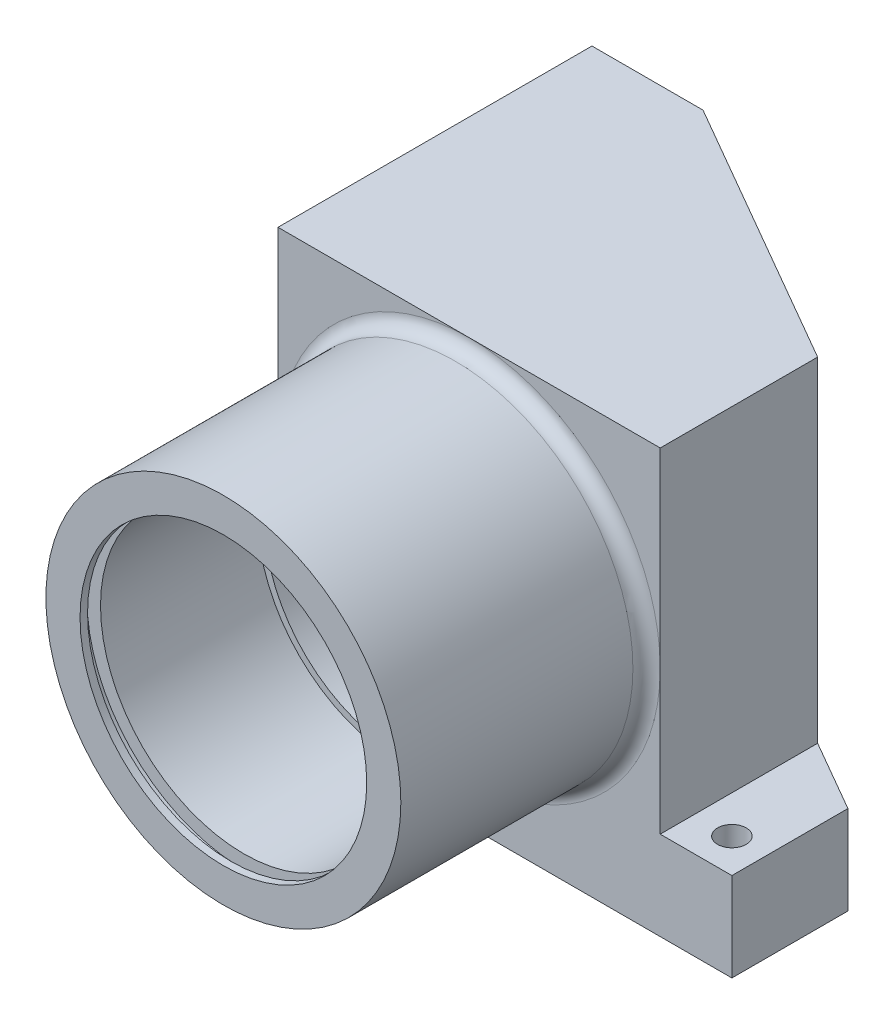
ISO-10303-21;
HEADER;
FILE_DESCRIPTION(('STEP AP214'),'2;1');
FILE_NAME('part.step','',(''),(''),'','','');
FILE_SCHEMA(('AUTOMOTIVE_DESIGN { 1 0 10303 214 1 1 1 1 }'));
ENDSEC;
DATA;
#1=APPLICATION_CONTEXT('core data for automotive mechanical design processes');
#2=APPLICATION_PROTOCOL_DEFINITION('international standard','automotive_design',2000,#1);
#3=PRODUCT_CONTEXT('',#1,'mechanical');
#4=PRODUCT('Part','Part','',(#3));
#5=PRODUCT_RELATED_PRODUCT_CATEGORY('part','',(#4));
#6=PRODUCT_DEFINITION_FORMATION('','',#4);
#7=PRODUCT_DEFINITION_CONTEXT('part definition',#1,'design');
#8=PRODUCT_DEFINITION('design','',#6,#7);
#9=PRODUCT_DEFINITION_SHAPE('','',#8);
#10=(LENGTH_UNIT() NAMED_UNIT(*) SI_UNIT(.MILLI.,.METRE.));
#11=(NAMED_UNIT(*) PLANE_ANGLE_UNIT() SI_UNIT($,.RADIAN.));
#12=(NAMED_UNIT(*) SI_UNIT($,.STERADIAN.) SOLID_ANGLE_UNIT());
#13=UNCERTAINTY_MEASURE_WITH_UNIT(LENGTH_MEASURE(1.E-05),#10,'distance_accuracy_value','');
#14=(GEOMETRIC_REPRESENTATION_CONTEXT(3) GLOBAL_UNCERTAINTY_ASSIGNED_CONTEXT((#13)) GLOBAL_UNIT_ASSIGNED_CONTEXT((#10,
#11,#12)) REPRESENTATION_CONTEXT('',''));
#15=CARTESIAN_POINT('',(0.,0.,0.));
#16=DIRECTION('',(0.,0.,1.));
#17=DIRECTION('',(1.,0.,0.));
#18=AXIS2_PLACEMENT_3D('',#15,#16,#17);
#19=CARTESIAN_POINT('',(28.,-34.,82.));
#20=DIRECTION('',(-1.,0.,0.));
#21=DIRECTION('',(0.,0.,1.));
#22=AXIS2_PLACEMENT_3D('',#19,#20,#21);
#23=PLANE('',#22);
#24=DIRECTION('',(0.,-1.,0.));
#25=VECTOR('',#24,1.);
#26=CARTESIAN_POINT('',(28.,-34.,22.937822173509));
#27=LINE('',#26,#25);
#28=CARTESIAN_POINT('',(28.,28.,22.937822173509));
#29=VERTEX_POINT('',#28);
#30=CARTESIAN_POINT('',(28.,-21.,22.937822173509));
#31=VERTEX_POINT('',#30);
#32=EDGE_CURVE('E52',#29,#31,#27,.T.);
#33=ORIENTED_EDGE('',*,*,#32,.F.);
#34=DIRECTION('',(0.,0.,-1.));
#35=VECTOR('',#34,1.);
#36=CARTESIAN_POINT('',(28.,28.,82.));
#37=LINE('',#36,#35);
#38=CARTESIAN_POINT('',(28.,28.,46.));
#39=VERTEX_POINT('',#38);
#40=EDGE_CURVE('E234',#39,#29,#37,.T.);
#41=ORIENTED_EDGE('',*,*,#40,.F.);
#42=DIRECTION('',(0.,1.,0.));
#43=VECTOR('',#42,1.);
#44=CARTESIAN_POINT('',(28.,-34.,46.));
#45=LINE('',#44,#43);
#46=CARTESIAN_POINT('',(28.,0.,46.));
#47=VERTEX_POINT('',#46);
#48=EDGE_CURVE('E191',#47,#39,#45,.T.);
#49=ORIENTED_EDGE('',*,*,#48,.F.);
#50=CARTESIAN_POINT('',(28.,-21.,46.));
#51=VERTEX_POINT('',#50);
#52=EDGE_CURVE('E193',#51,#47,#45,.T.);
#53=ORIENTED_EDGE('',*,*,#52,.F.);
#54=DIRECTION('',(0.,0.,1.));
#55=VECTOR('',#54,1.);
#56=CARTESIAN_POINT('',(28.,-21.,0.));
#57=LINE('',#56,#55);
#58=EDGE_CURVE('E176',#31,#51,#57,.T.);
#59=ORIENTED_EDGE('',*,*,#58,.F.);
#60=EDGE_LOOP('',(#33,#41,#49,#53,#59));
#61=FACE_BOUND('',#60,.T.);
#62=ADVANCED_FACE('F37',(#61),#23,.F.);
#63=CARTESIAN_POINT('',(-28.,28.,82.));
#64=DIRECTION('',(0.,-1.,0.));
#65=DIRECTION('',(0.,0.,-1.));
#66=AXIS2_PLACEMENT_3D('',#63,#64,#65);
#67=PLANE('',#66);
#68=DIRECTION('',(0.866025403784442,0.,0.499999999999995));
#69=VECTOR('',#68,1.);
#70=CARTESIAN_POINT('',(11.5746732002871,28.,13.4546553241673));
#71=LINE('',#70,#69);
#72=CARTESIAN_POINT('',(-11.7294734194981,28.,0.));
#73=VERTEX_POINT('',#72);
#74=EDGE_CURVE('E59',#73,#29,#71,.T.);
#75=ORIENTED_EDGE('',*,*,#74,.F.);
#76=DIRECTION('',(-1.,0.,0.));
#77=VECTOR('',#76,1.);
#78=CARTESIAN_POINT('',(-28.,28.,0.));
#79=LINE('',#78,#77);
#80=CARTESIAN_POINT('',(-28.,28.,0.));
#81=VERTEX_POINT('',#80);
#82=EDGE_CURVE('E224',#73,#81,#79,.T.);
#83=ORIENTED_EDGE('',*,*,#82,.T.);
#84=DIRECTION('',(0.,0.,-1.));
#85=VECTOR('',#84,1.);
#86=CARTESIAN_POINT('',(-28.,28.,82.));
#87=LINE('',#86,#85);
#88=CARTESIAN_POINT('',(-28.,28.,46.));
#89=VERTEX_POINT('',#88);
#90=EDGE_CURVE('E231',#89,#81,#87,.T.);
#91=ORIENTED_EDGE('',*,*,#90,.F.);
#92=DIRECTION('',(-1.,0.,0.));
#93=VECTOR('',#92,1.);
#94=CARTESIAN_POINT('',(28.,28.,46.));
#95=LINE('',#94,#93);
#96=CARTESIAN_POINT('',(0.,28.,46.));
#97=VERTEX_POINT('',#96);
#98=EDGE_CURVE('E195',#97,#89,#95,.T.);
#99=ORIENTED_EDGE('',*,*,#98,.F.);
#100=EDGE_CURVE('E196',#39,#97,#95,.T.);
#101=ORIENTED_EDGE('',*,*,#100,.F.);
#102=ORIENTED_EDGE('',*,*,#40,.T.);
#103=EDGE_LOOP('',(#75,#83,#91,#99,#101,#102));
#104=FACE_BOUND('',#103,.T.);
#105=ADVANCED_FACE('F265',(#104),#67,.F.);
#106=CARTESIAN_POINT('',(-28.,-34.,82.));
#107=DIRECTION('',(0.,1.,0.));
#108=DIRECTION('',(0.,0.,1.));
#109=AXIS2_PLACEMENT_3D('',#106,#107,#108);
#110=PLANE('',#109);
#111=CARTESIAN_POINT('',(-33.5,-34.,5.));
#112=DIRECTION('',(0.,-1.,0.));
#113=DIRECTION('',(0.,0.,-1.));
#114=AXIS2_PLACEMENT_3D('',#111,#112,#113);
#115=CIRCLE('',#114,2.1);
#116=CARTESIAN_POINT('',(-33.5,-34.,2.9));
#117=VERTEX_POINT('',#116);
#118=EDGE_CURVE('E336',#117,#117,#115,.T.);
#119=ORIENTED_EDGE('',*,*,#118,.F.);
#120=EDGE_LOOP('',(#119));
#121=FACE_BOUND('',#120,.T.);
#122=CARTESIAN_POINT('',(33.5,-34.,41.));
#123=DIRECTION('',(0.,-1.,0.));
#124=DIRECTION('',(0.,0.,-1.));
#125=AXIS2_PLACEMENT_3D('',#122,#123,#124);
#126=CIRCLE('',#125,2.1);
#127=CARTESIAN_POINT('',(33.5,-34.,38.9));
#128=VERTEX_POINT('',#127);
#129=EDGE_CURVE('E330',#128,#128,#126,.T.);
#130=ORIENTED_EDGE('',*,*,#129,.F.);
#131=EDGE_LOOP('',(#130));
#132=FACE_BOUND('',#131,.T.);
#133=CARTESIAN_POINT('',(-33.5,-34.,41.));
#134=DIRECTION('',(0.,-1.,0.));
#135=DIRECTION('',(0.,0.,-1.));
#136=AXIS2_PLACEMENT_3D('',#133,#134,#135);
#137=CIRCLE('',#136,2.1);
#138=CARTESIAN_POINT('',(-33.5,-34.,38.9));
#139=VERTEX_POINT('',#138);
#140=EDGE_CURVE('E324',#139,#139,#137,.T.);
#141=ORIENTED_EDGE('',*,*,#140,.F.);
#142=EDGE_LOOP('',(#141));
#143=FACE_BOUND('',#142,.T.);
#144=DIRECTION('',(-0.866025403784442,0.,-0.499999999999995));
#145=VECTOR('',#144,1.);
#146=CARTESIAN_POINT('',(38.5,-34.,29.));
#147=LINE('',#146,#145);
#148=CARTESIAN_POINT('',(38.5,-34.,29.));
#149=VERTEX_POINT('',#148);
#150=CARTESIAN_POINT('',(-11.7294734194981,-34.,0.));
#151=VERTEX_POINT('',#150);
#152=EDGE_CURVE('E140',#149,#151,#147,.T.);
#153=ORIENTED_EDGE('',*,*,#152,.F.);
#154=DIRECTION('',(0.,0.,1.));
#155=VECTOR('',#154,1.);
#156=CARTESIAN_POINT('',(38.5,-34.,0.));
#157=LINE('',#156,#155);
#158=CARTESIAN_POINT('',(38.5,-34.,46.));
#159=VERTEX_POINT('',#158);
#160=EDGE_CURVE('E132',#149,#159,#157,.T.);
#161=ORIENTED_EDGE('',*,*,#160,.T.);
#162=DIRECTION('',(1.,0.,0.));
#163=VECTOR('',#162,1.);
#164=CARTESIAN_POINT('',(-28.,-34.,46.));
#165=LINE('',#164,#163);
#166=CARTESIAN_POINT('',(-38.5,-34.,46.));
#167=VERTEX_POINT('',#166);
#168=EDGE_CURVE('E203',#167,#159,#165,.T.);
#169=ORIENTED_EDGE('',*,*,#168,.F.);
#170=DIRECTION('',(0.,0.,1.));
#171=VECTOR('',#170,1.);
#172=CARTESIAN_POINT('',(-38.5,-34.,0.));
#173=LINE('',#172,#171);
#174=CARTESIAN_POINT('',(-38.5,-34.,0.));
#175=VERTEX_POINT('',#174);
#176=EDGE_CURVE('E155',#175,#167,#173,.T.);
#177=ORIENTED_EDGE('',*,*,#176,.F.);
#178=DIRECTION('',(1.,0.,0.));
#179=VECTOR('',#178,1.);
#180=CARTESIAN_POINT('',(-28.,-34.,0.));
#181=LINE('',#180,#179);
#182=EDGE_CURVE('E228',#175,#151,#181,.T.);
#183=ORIENTED_EDGE('',*,*,#182,.T.);
#184=EDGE_LOOP('',(#153,#161,#169,#177,#183));
#185=FACE_BOUND('',#184,.T.);
#186=ADVANCED_FACE('F302',(#121,#132,#143,#185),#110,.F.);
#187=CARTESIAN_POINT('',(28.,28.,0.));
#188=DIRECTION('',(0.,0.,-1.));
#189=DIRECTION('',(-1.,0.,0.));
#190=AXIS2_PLACEMENT_3D('',#187,#188,#189);
#191=PLANE('',#190);
#192=ORIENTED_EDGE('',*,*,#82,.F.);
#193=DIRECTION('',(0.,1.,0.));
#194=VECTOR('',#193,1.);
#195=CARTESIAN_POINT('',(-11.7294734194981,-34.,0.));
#196=LINE('',#195,#194);
#197=CARTESIAN_POINT('',(-11.7294734194981,19.7843234228843,0.));
#198=VERTEX_POINT('',#197);
#199=EDGE_CURVE('E150',#198,#73,#196,.T.);
#200=ORIENTED_EDGE('',*,*,#199,.F.);
#201=CARTESIAN_POINT('',(0.,0.,0.));
#202=DIRECTION('',(0.,0.,-1.));
#203=DIRECTION('',(-1.,0.,0.));
#204=AXIS2_PLACEMENT_3D('',#201,#202,#203);
#205=CIRCLE('',#204,23.);
#206=CARTESIAN_POINT('',(-11.7294734194981,-19.7843234228843,0.));
#207=VERTEX_POINT('',#206);
#208=EDGE_CURVE('E215',#207,#198,#205,.T.);
#209=ORIENTED_EDGE('',*,*,#208,.F.);
#210=EDGE_CURVE('E146',#151,#207,#196,.T.);
#211=ORIENTED_EDGE('',*,*,#210,.F.);
#212=ORIENTED_EDGE('',*,*,#182,.F.);
#213=DIRECTION('',(0.,-1.,0.));
#214=VECTOR('',#213,1.);
#215=CARTESIAN_POINT('',(-38.5,-21.,0.));
#216=LINE('',#215,#214);
#217=CARTESIAN_POINT('',(-38.5,-21.,0.));
#218=VERTEX_POINT('',#217);
#219=EDGE_CURVE('E170',#218,#175,#216,.T.);
#220=ORIENTED_EDGE('',*,*,#219,.F.);
#221=DIRECTION('',(1.,0.,0.));
#222=VECTOR('',#221,1.);
#223=CARTESIAN_POINT('',(0.,-21.,0.));
#224=LINE('',#223,#222);
#225=CARTESIAN_POINT('',(-28.,-21.,0.));
#226=VERTEX_POINT('',#225);
#227=EDGE_CURVE('E161',#218,#226,#224,.T.);
#228=ORIENTED_EDGE('',*,*,#227,.T.);
#229=DIRECTION('',(0.,-1.,0.));
#230=VECTOR('',#229,1.);
#231=CARTESIAN_POINT('',(-28.,-34.,0.));
#232=LINE('',#231,#230);
#233=EDGE_CURVE('E226',#81,#226,#232,.T.);
#234=ORIENTED_EDGE('',*,*,#233,.F.);
#235=EDGE_LOOP('',(#192,#200,#209,#211,#212,#220,#228,#234));
#236=FACE_BOUND('',#235,.T.);
#237=ADVANCED_FACE('F308',(#236),#191,.T.);
#238=CARTESIAN_POINT('',(0.,0.,-5.71926183618582));
#239=DIRECTION('',(0.,0.,-1.));
#240=DIRECTION('',(-1.,0.,0.));
#241=AXIS2_PLACEMENT_3D('',#238,#239,#240);
#242=CYLINDRICAL_SURFACE('',#241,23.);
#243=CARTESIAN_POINT('',(0.,0.,52.));
#244=DIRECTION('',(0.,0.,-1.));
#245=DIRECTION('',(-1.,0.,0.));
#246=AXIS2_PLACEMENT_3D('',#243,#244,#245);
#247=CIRCLE('',#246,23.);
#248=CARTESIAN_POINT('',(-23.,0.,52.));
#249=VERTEX_POINT('',#248);
#250=EDGE_CURVE('E212',#249,#249,#247,.T.);
#251=ORIENTED_EDGE('',*,*,#250,.F.);
#252=EDGE_LOOP('',(#251));
#253=FACE_BOUND('',#252,.T.);
#254=CARTESIAN_POINT('',(0.,0.,6.77201463619972));
#255=DIRECTION('',(0.499999999999995,0.,-0.866025403784442));
#256=DIRECTION('',(-0.866025403784442,0.,-0.499999999999995));
#257=AXIS2_PLACEMENT_3D('',#254,#255,#256);
#258=ELLIPSE('',#257,26.5581123827227,23.);
#259=EDGE_CURVE('E148',#207,#198,#258,.F.);
#260=ORIENTED_EDGE('',*,*,#259,.F.);
#261=ORIENTED_EDGE('',*,*,#208,.T.);
#262=EDGE_LOOP('',(#260,#261));
#263=FACE_BOUND('',#262,.T.);
#264=ADVANCED_FACE('F311',(#253,#263),#242,.F.);
#265=CARTESIAN_POINT('',(38.5,-21.,0.));
#266=DIRECTION('',(1.,0.,0.));
#267=DIRECTION('',(0.,0.,-1.));
#268=AXIS2_PLACEMENT_3D('',#265,#266,#267);
#269=PLANE('',#268);
#270=ORIENTED_EDGE('',*,*,#160,.F.);
#271=DIRECTION('',(0.,1.,0.));
#272=VECTOR('',#271,1.);
#273=CARTESIAN_POINT('',(38.5,-34.,29.));
#274=LINE('',#273,#272);
#275=CARTESIAN_POINT('',(38.5,-21.,29.));
#276=VERTEX_POINT('',#275);
#277=EDGE_CURVE('E136',#149,#276,#274,.T.);
#278=ORIENTED_EDGE('',*,*,#277,.T.);
#279=DIRECTION('',(0.,0.,1.));
#280=VECTOR('',#279,1.);
#281=CARTESIAN_POINT('',(38.5,-21.,0.));
#282=LINE('',#281,#280);
#283=CARTESIAN_POINT('',(38.5,-21.,46.));
#284=VERTEX_POINT('',#283);
#285=EDGE_CURVE('E124',#276,#284,#282,.T.);
#286=ORIENTED_EDGE('',*,*,#285,.T.);
#287=DIRECTION('',(0.,-1.,0.));
#288=VECTOR('',#287,1.);
#289=CARTESIAN_POINT('',(38.5,-21.,46.));
#290=LINE('',#289,#288);
#291=EDGE_CURVE('E178',#284,#159,#290,.T.);
#292=ORIENTED_EDGE('',*,*,#291,.T.);
#293=EDGE_LOOP('',(#270,#278,#286,#292));
#294=FACE_BOUND('',#293,.T.);
#295=ADVANCED_FACE('F137',(#294),#269,.T.);
#296=CARTESIAN_POINT('',(0.,-21.,0.));
#297=DIRECTION('',(0.,-1.,0.));
#298=DIRECTION('',(0.,0.,-1.));
#299=AXIS2_PLACEMENT_3D('',#296,#297,#298);
#300=PLANE('',#299);
#301=CARTESIAN_POINT('',(33.5,-21.,41.));
#302=DIRECTION('',(0.,-1.,0.));
#303=DIRECTION('',(0.,0.,-1.));
#304=AXIS2_PLACEMENT_3D('',#301,#302,#303);
#305=CIRCLE('',#304,2.1);
#306=CARTESIAN_POINT('',(33.5,-21.,38.9));
#307=VERTEX_POINT('',#306);
#308=EDGE_CURVE('E327',#307,#307,#305,.T.);
#309=ORIENTED_EDGE('',*,*,#308,.T.);
#310=EDGE_LOOP('',(#309));
#311=FACE_BOUND('',#310,.T.);
#312=DIRECTION('',(0.866025403784442,0.,0.499999999999995));
#313=VECTOR('',#312,1.);
#314=CARTESIAN_POINT('',(-2.93236835487448,-21.,5.07901097714982));
#315=LINE('',#314,#313);
#316=EDGE_CURVE('E11',#31,#276,#315,.T.);
#317=ORIENTED_EDGE('',*,*,#316,.F.);
#318=ORIENTED_EDGE('',*,*,#58,.T.);
#319=DIRECTION('',(1.,0.,0.));
#320=VECTOR('',#319,1.);
#321=CARTESIAN_POINT('',(0.,-21.,46.));
#322=LINE('',#321,#320);
#323=EDGE_CURVE('E128',#51,#284,#322,.T.);
#324=ORIENTED_EDGE('',*,*,#323,.T.);
#325=ORIENTED_EDGE('',*,*,#285,.F.);
#326=EDGE_LOOP('',(#317,#318,#324,#325));
#327=FACE_BOUND('',#326,.T.);
#328=ADVANCED_FACE('F126',(#311,#327),#300,.F.);
#329=CARTESIAN_POINT('',(-28.,-34.,82.));
#330=DIRECTION('',(1.,0.,0.));
#331=DIRECTION('',(0.,0.,-1.));
#332=AXIS2_PLACEMENT_3D('',#329,#330,#331);
#333=PLANE('',#332);
#334=DIRECTION('',(0.,0.,-1.));
#335=VECTOR('',#334,1.);
#336=CARTESIAN_POINT('',(-28.,-21.,0.));
#337=LINE('',#336,#335);
#338=CARTESIAN_POINT('',(-28.,-21.,46.));
#339=VERTEX_POINT('',#338);
#340=EDGE_CURVE('E164',#339,#226,#337,.T.);
#341=ORIENTED_EDGE('',*,*,#340,.F.);
#342=DIRECTION('',(0.,-1.,0.));
#343=VECTOR('',#342,1.);
#344=CARTESIAN_POINT('',(-28.,28.,46.));
#345=LINE('',#344,#343);
#346=CARTESIAN_POINT('',(-28.,0.,46.));
#347=VERTEX_POINT('',#346);
#348=EDGE_CURVE('E199',#347,#339,#345,.T.);
#349=ORIENTED_EDGE('',*,*,#348,.F.);
#350=EDGE_CURVE('E200',#89,#347,#345,.T.);
#351=ORIENTED_EDGE('',*,*,#350,.F.);
#352=ORIENTED_EDGE('',*,*,#90,.T.);
#353=ORIENTED_EDGE('',*,*,#233,.T.);
#354=EDGE_LOOP('',(#341,#349,#351,#352,#353));
#355=FACE_BOUND('',#354,.T.);
#356=ADVANCED_FACE('F259',(#355),#333,.F.);
#357=CARTESIAN_POINT('',(28.,28.,46.));
#358=DIRECTION('',(0.,0.,1.));
#359=DIRECTION('',(1.,0.,0.));
#360=AXIS2_PLACEMENT_3D('',#357,#358,#359);
#361=PLANE('',#360);
#362=ORIENTED_EDGE('',*,*,#168,.T.);
#363=ORIENTED_EDGE('',*,*,#291,.F.);
#364=ORIENTED_EDGE('',*,*,#323,.F.);
#365=ORIENTED_EDGE('',*,*,#52,.T.);
#366=CARTESIAN_POINT('',(0.,0.,46.));
#367=DIRECTION('',(0.,0.,1.));
#368=DIRECTION('',(1.,0.,0.));
#369=AXIS2_PLACEMENT_3D('',#366,#367,#368);
#370=CIRCLE('',#369,28.);
#371=EDGE_CURVE('E45',#47,#347,#370,.F.);
#372=ORIENTED_EDGE('',*,*,#371,.T.);
#373=ORIENTED_EDGE('',*,*,#348,.T.);
#374=DIRECTION('',(1.,0.,0.));
#375=VECTOR('',#374,1.);
#376=CARTESIAN_POINT('',(0.,-21.,46.));
#377=LINE('',#376,#375);
#378=CARTESIAN_POINT('',(-38.5,-21.,46.));
#379=VERTEX_POINT('',#378);
#380=EDGE_CURVE('E156',#379,#339,#377,.T.);
#381=ORIENTED_EDGE('',*,*,#380,.F.);
#382=DIRECTION('',(0.,-1.,0.));
#383=VECTOR('',#382,1.);
#384=CARTESIAN_POINT('',(-38.5,-21.,46.));
#385=LINE('',#384,#383);
#386=EDGE_CURVE('E167',#379,#167,#385,.T.);
#387=ORIENTED_EDGE('',*,*,#386,.T.);
#388=EDGE_LOOP('',(#362,#363,#364,#365,#372,#373,#381,#387));
#389=FACE_BOUND('',#388,.T.);
#390=ADVANCED_FACE('F252',(#389),#361,.T.);
#391=ORIENTED_EDGE('',*,*,#350,.T.);
#392=CARTESIAN_POINT('',(0.,0.,46.));
#393=DIRECTION('',(0.,0.,1.));
#394=DIRECTION('',(1.,0.,0.));
#395=AXIS2_PLACEMENT_3D('',#392,#393,#394);
#396=CIRCLE('',#395,28.);
#397=EDGE_CURVE('E246',#347,#97,#396,.F.);
#398=ORIENTED_EDGE('',*,*,#397,.T.);
#399=ORIENTED_EDGE('',*,*,#98,.T.);
#400=EDGE_LOOP('',(#391,#398,#399));
#401=FACE_BOUND('',#400,.T.);
#402=ADVANCED_FACE('F262',(#401),#361,.T.);
#403=CARTESIAN_POINT('',(0.,0.,-5.71926183618582));
#404=DIRECTION('',(0.,0.,-1.));
#405=DIRECTION('',(-1.,0.,0.));
#406=AXIS2_PLACEMENT_3D('',#403,#404,#405);
#407=CYLINDRICAL_SURFACE('',#406,21.);
#408=CARTESIAN_POINT('',(0.,0.,79.));
#409=DIRECTION('',(0.,0.,-1.));
#410=DIRECTION('',(-1.,0.,0.));
#411=AXIS2_PLACEMENT_3D('',#408,#409,#410);
#412=CIRCLE('',#411,21.);
#413=CARTESIAN_POINT('',(-21.,0.,79.));
#414=VERTEX_POINT('',#413);
#415=EDGE_CURVE('E192',#414,#414,#412,.F.);
#416=ORIENTED_EDGE('',*,*,#415,.T.);
#417=EDGE_LOOP('',(#416));
#418=FACE_BOUND('',#417,.T.);
#419=CARTESIAN_POINT('',(0.,0.,56.));
#420=DIRECTION('',(0.,0.,-1.));
#421=DIRECTION('',(-1.,0.,0.));
#422=AXIS2_PLACEMENT_3D('',#419,#420,#421);
#423=CIRCLE('',#422,21.);
#424=CARTESIAN_POINT('',(-21.,0.,56.));
#425=VERTEX_POINT('',#424);
#426=EDGE_CURVE('E221',#425,#425,#423,.T.);
#427=ORIENTED_EDGE('',*,*,#426,.T.);
#428=EDGE_LOOP('',(#427));
#429=FACE_BOUND('',#428,.T.);
#430=ADVANCED_FACE('F285',(#418,#429),#407,.F.);
#431=CARTESIAN_POINT('',(28.,28.,82.));
#432=DIRECTION('',(0.,0.,-1.));
#433=DIRECTION('',(-1.,0.,0.));
#434=AXIS2_PLACEMENT_3D('',#431,#432,#433);
#435=PLANE('',#434);
#436=CARTESIAN_POINT('',(0.,0.,82.));
#437=DIRECTION('',(0.,0.,-1.));
#438=DIRECTION('',(-1.,0.,0.));
#439=AXIS2_PLACEMENT_3D('',#436,#437,#438);
#440=CIRCLE('',#439,21.);
#441=CARTESIAN_POINT('',(-21.,0.,82.));
#442=VERTEX_POINT('',#441);
#443=EDGE_CURVE('E218',#442,#442,#440,.T.);
#444=ORIENTED_EDGE('',*,*,#443,.T.);
#445=EDGE_LOOP('',(#444));
#446=FACE_BOUND('',#445,.T.);
#447=CARTESIAN_POINT('',(0.,0.,82.));
#448=DIRECTION('',(0.,0.,1.));
#449=DIRECTION('',(1.,0.,0.));
#450=AXIS2_PLACEMENT_3D('',#447,#448,#449);
#451=CIRCLE('',#450,26.);
#452=CARTESIAN_POINT('',(26.,0.,82.));
#453=VERTEX_POINT('',#452);
#454=EDGE_CURVE('E188',#453,#453,#451,.T.);
#455=ORIENTED_EDGE('',*,*,#454,.T.);
#456=EDGE_LOOP('',(#455));
#457=FACE_BOUND('',#456,.T.);
#458=ADVANCED_FACE('F282',(#446,#457),#435,.F.);
#459=CARTESIAN_POINT('',(0.,21.,56.));
#460=DIRECTION('',(0.,0.,-1.));
#461=DIRECTION('',(-1.,0.,0.));
#462=AXIS2_PLACEMENT_3D('',#459,#460,#461);
#463=PLANE('',#462);
#464=ORIENTED_EDGE('',*,*,#426,.F.);
#465=EDGE_LOOP('',(#464));
#466=FACE_BOUND('',#465,.T.);
#467=CARTESIAN_POINT('',(0.,0.,56.));
#468=DIRECTION('',(0.,0.,-1.));
#469=DIRECTION('',(-1.,0.,0.));
#470=AXIS2_PLACEMENT_3D('',#467,#468,#469);
#471=CIRCLE('',#470,20.);
#472=CARTESIAN_POINT('',(-20.,0.,56.));
#473=VERTEX_POINT('',#472);
#474=EDGE_CURVE('E206',#473,#473,#471,.T.);
#475=ORIENTED_EDGE('',*,*,#474,.T.);
#476=EDGE_LOOP('',(#475));
#477=FACE_BOUND('',#476,.T.);
#478=ADVANCED_FACE('F284',(#466,#477),#463,.F.);
#479=CARTESIAN_POINT('',(0.,0.,80.9));
#480=DIRECTION('',(0.,0.,1.));
#481=DIRECTION('',(1.,0.,0.));
#482=AXIS2_PLACEMENT_3D('',#479,#480,#481);
#483=CIRCLE('',#482,21.);
#484=CARTESIAN_POINT('',(21.,0.,80.9));
#485=VERTEX_POINT('',#484);
#486=EDGE_CURVE('E187',#485,#485,#483,.F.);
#487=ORIENTED_EDGE('',*,*,#486,.T.);
#488=EDGE_LOOP('',(#487));
#489=FACE_BOUND('',#488,.T.);
#490=ORIENTED_EDGE('',*,*,#443,.F.);
#491=EDGE_LOOP('',(#490));
#492=FACE_BOUND('',#491,.T.);
#493=ADVANCED_FACE('F292',(#489,#492),#407,.F.);
#494=CARTESIAN_POINT('',(0.,23.,52.));
#495=DIRECTION('',(0.,0.,1.));
#496=DIRECTION('',(1.,0.,0.));
#497=AXIS2_PLACEMENT_3D('',#494,#495,#496);
#498=PLANE('',#497);
#499=CARTESIAN_POINT('',(0.,0.,52.));
#500=DIRECTION('',(0.,0.,-1.));
#501=DIRECTION('',(-1.,0.,0.));
#502=AXIS2_PLACEMENT_3D('',#499,#500,#501);
#503=CIRCLE('',#502,20.);
#504=CARTESIAN_POINT('',(-20.,0.,52.));
#505=VERTEX_POINT('',#504);
#506=EDGE_CURVE('E209',#505,#505,#503,.T.);
#507=ORIENTED_EDGE('',*,*,#506,.F.);
#508=EDGE_LOOP('',(#507));
#509=FACE_BOUND('',#508,.T.);
#510=ORIENTED_EDGE('',*,*,#250,.T.);
#511=EDGE_LOOP('',(#510));
#512=FACE_BOUND('',#511,.T.);
#513=ADVANCED_FACE('F387',(#509,#512),#498,.F.);
#514=CARTESIAN_POINT('',(0.,0.,-5.71926183618582));
#515=DIRECTION('',(0.,0.,-1.));
#516=DIRECTION('',(-1.,0.,0.));
#517=AXIS2_PLACEMENT_3D('',#514,#515,#516);
#518=CYLINDRICAL_SURFACE('',#517,20.);
#519=ORIENTED_EDGE('',*,*,#474,.F.);
#520=EDGE_LOOP('',(#519));
#521=FACE_BOUND('',#520,.T.);
#522=ORIENTED_EDGE('',*,*,#506,.T.);
#523=EDGE_LOOP('',(#522));
#524=FACE_BOUND('',#523,.T.);
#525=ADVANCED_FACE('F384',(#521,#524),#518,.F.);
#526=ORIENTED_EDGE('',*,*,#100,.T.);
#527=CARTESIAN_POINT('',(0.,0.,46.));
#528=DIRECTION('',(0.,0.,1.));
#529=DIRECTION('',(1.,0.,0.));
#530=AXIS2_PLACEMENT_3D('',#527,#528,#529);
#531=CIRCLE('',#530,28.);
#532=EDGE_CURVE('E243',#97,#47,#531,.F.);
#533=ORIENTED_EDGE('',*,*,#532,.T.);
#534=ORIENTED_EDGE('',*,*,#48,.T.);
#535=EDGE_LOOP('',(#526,#533,#534));
#536=FACE_BOUND('',#535,.T.);
#537=ADVANCED_FACE('F267',(#536),#361,.T.);
#538=CARTESIAN_POINT('',(0.,0.,46.));
#539=DIRECTION('',(0.,0.,1.));
#540=DIRECTION('',(1.,0.,0.));
#541=AXIS2_PLACEMENT_3D('',#538,#539,#540);
#542=CYLINDRICAL_SURFACE('',#541,26.);
#543=CARTESIAN_POINT('',(0.,0.,48.));
#544=DIRECTION('',(0.,0.,1.));
#545=DIRECTION('',(1.,0.,0.));
#546=AXIS2_PLACEMENT_3D('',#543,#544,#545);
#547=CIRCLE('',#546,26.);
#548=CARTESIAN_POINT('',(26.,0.,48.));
#549=VERTEX_POINT('',#548);
#550=EDGE_CURVE('E236',#549,#549,#547,.T.);
#551=ORIENTED_EDGE('',*,*,#550,.T.);
#552=EDGE_LOOP('',(#551));
#553=FACE_BOUND('',#552,.T.);
#554=ORIENTED_EDGE('',*,*,#454,.F.);
#555=EDGE_LOOP('',(#554));
#556=FACE_BOUND('',#555,.T.);
#557=ADVANCED_FACE('F275',(#553,#556),#542,.T.);
#558=CARTESIAN_POINT('',(0.,0.,79.));
#559=DIRECTION('',(0.,0.,-1.));
#560=DIRECTION('',(-1.,0.,0.));
#561=AXIS2_PLACEMENT_3D('',#558,#559,#560);
#562=PLANE('',#561);
#563=CARTESIAN_POINT('',(0.,0.,79.));
#564=DIRECTION('',(0.,0.,-1.));
#565=DIRECTION('',(-1.,0.,0.));
#566=AXIS2_PLACEMENT_3D('',#563,#564,#565);
#567=CIRCLE('',#566,23.);
#568=CARTESIAN_POINT('',(-23.,0.,79.));
#569=VERTEX_POINT('',#568);
#570=EDGE_CURVE('E184',#569,#569,#567,.T.);
#571=ORIENTED_EDGE('',*,*,#570,.F.);
#572=EDGE_LOOP('',(#571));
#573=FACE_BOUND('',#572,.T.);
#574=ORIENTED_EDGE('',*,*,#415,.F.);
#575=EDGE_LOOP('',(#574));
#576=FACE_BOUND('',#575,.T.);
#577=ADVANCED_FACE('F278',(#573,#576),#562,.F.);
#578=CARTESIAN_POINT('',(0.,0.,80.9));
#579=DIRECTION('',(0.,0.,1.));
#580=DIRECTION('',(1.,0.,0.));
#581=AXIS2_PLACEMENT_3D('',#578,#579,#580);
#582=PLANE('',#581);
#583=CARTESIAN_POINT('',(0.,0.,80.9));
#584=DIRECTION('',(0.,0.,-1.));
#585=DIRECTION('',(-1.,0.,0.));
#586=AXIS2_PLACEMENT_3D('',#583,#584,#585);
#587=CIRCLE('',#586,23.);
#588=CARTESIAN_POINT('',(-23.,0.,80.9));
#589=VERTEX_POINT('',#588);
#590=EDGE_CURVE('E181',#589,#589,#587,.T.);
#591=ORIENTED_EDGE('',*,*,#590,.T.);
#592=EDGE_LOOP('',(#591));
#593=FACE_BOUND('',#592,.T.);
#594=ORIENTED_EDGE('',*,*,#486,.F.);
#595=EDGE_LOOP('',(#594));
#596=FACE_BOUND('',#595,.T.);
#597=ADVANCED_FACE('F372',(#593,#596),#582,.F.);
#598=CARTESIAN_POINT('',(0.,0.,0.));
#599=DIRECTION('',(0.,0.,-1.));
#600=DIRECTION('',(-1.,0.,0.));
#601=AXIS2_PLACEMENT_3D('',#598,#599,#600);
#602=CYLINDRICAL_SURFACE('',#601,23.);
#603=ORIENTED_EDGE('',*,*,#590,.F.);
#604=EDGE_LOOP('',(#603));
#605=FACE_BOUND('',#604,.T.);
#606=ORIENTED_EDGE('',*,*,#570,.T.);
#607=EDGE_LOOP('',(#606));
#608=FACE_BOUND('',#607,.T.);
#609=ADVANCED_FACE('F272',(#605,#608),#602,.F.);
#610=CARTESIAN_POINT('',(0.,0.,48.));
#611=DIRECTION('',(0.,0.,1.));
#612=DIRECTION('',(1.,0.,0.));
#613=AXIS2_PLACEMENT_3D('',#610,#611,#612);
#614=TOROIDAL_SURFACE('',#613,28.,2.);
#615=ORIENTED_EDGE('',*,*,#397,.F.);
#616=ORIENTED_EDGE('',*,*,#371,.F.);
#617=ORIENTED_EDGE('',*,*,#532,.F.);
#618=EDGE_LOOP('',(#615,#616,#617));
#619=FACE_BOUND('',#618,.T.);
#620=ORIENTED_EDGE('',*,*,#550,.F.);
#621=EDGE_LOOP('',(#620));
#622=FACE_BOUND('',#621,.T.);
#623=ADVANCED_FACE('F39',(#619,#622),#614,.F.);
#624=CARTESIAN_POINT('',(-38.5,-21.,0.));
#625=DIRECTION('',(1.,0.,0.));
#626=DIRECTION('',(0.,0.,-1.));
#627=AXIS2_PLACEMENT_3D('',#624,#625,#626);
#628=PLANE('',#627);
#629=ORIENTED_EDGE('',*,*,#176,.T.);
#630=ORIENTED_EDGE('',*,*,#386,.F.);
#631=DIRECTION('',(0.,0.,1.));
#632=VECTOR('',#631,1.);
#633=CARTESIAN_POINT('',(-38.5,-21.,0.));
#634=LINE('',#633,#632);
#635=EDGE_CURVE('E159',#218,#379,#634,.T.);
#636=ORIENTED_EDGE('',*,*,#635,.F.);
#637=ORIENTED_EDGE('',*,*,#219,.T.);
#638=EDGE_LOOP('',(#629,#630,#636,#637));
#639=FACE_BOUND('',#638,.T.);
#640=ADVANCED_FACE('F271',(#639),#628,.F.);
#641=CARTESIAN_POINT('',(0.,-21.,0.));
#642=DIRECTION('',(0.,-1.,0.));
#643=DIRECTION('',(0.,0.,-1.));
#644=AXIS2_PLACEMENT_3D('',#641,#642,#643);
#645=PLANE('',#644);
#646=CARTESIAN_POINT('',(-33.5,-21.,5.));
#647=DIRECTION('',(0.,-1.,0.));
#648=DIRECTION('',(0.,0.,-1.));
#649=AXIS2_PLACEMENT_3D('',#646,#647,#648);
#650=CIRCLE('',#649,2.1);
#651=CARTESIAN_POINT('',(-33.5,-21.,2.9));
#652=VERTEX_POINT('',#651);
#653=EDGE_CURVE('E333',#652,#652,#650,.T.);
#654=ORIENTED_EDGE('',*,*,#653,.T.);
#655=EDGE_LOOP('',(#654));
#656=FACE_BOUND('',#655,.T.);
#657=CARTESIAN_POINT('',(-33.5,-21.,41.));
#658=DIRECTION('',(0.,-1.,0.));
#659=DIRECTION('',(0.,0.,-1.));
#660=AXIS2_PLACEMENT_3D('',#657,#658,#659);
#661=CIRCLE('',#660,2.1);
#662=CARTESIAN_POINT('',(-33.5,-21.,38.9));
#663=VERTEX_POINT('',#662);
#664=EDGE_CURVE('E141',#663,#663,#661,.T.);
#665=ORIENTED_EDGE('',*,*,#664,.T.);
#666=EDGE_LOOP('',(#665));
#667=FACE_BOUND('',#666,.T.);
#668=ORIENTED_EDGE('',*,*,#380,.T.);
#669=ORIENTED_EDGE('',*,*,#340,.T.);
#670=ORIENTED_EDGE('',*,*,#227,.F.);
#671=ORIENTED_EDGE('',*,*,#635,.T.);
#672=EDGE_LOOP('',(#668,#669,#670,#671));
#673=FACE_BOUND('',#672,.T.);
#674=ADVANCED_FACE('F353',(#656,#667,#673),#645,.F.);
#675=CARTESIAN_POINT('',(38.5,-34.,29.));
#676=DIRECTION('',(0.499999999999995,0.,-0.866025403784442));
#677=DIRECTION('',(-0.866025403784442,0.,-0.499999999999995));
#678=AXIS2_PLACEMENT_3D('',#675,#676,#677);
#679=PLANE('',#678);
#680=ORIENTED_EDGE('',*,*,#210,.T.);
#681=ORIENTED_EDGE('',*,*,#259,.T.);
#682=ORIENTED_EDGE('',*,*,#199,.T.);
#683=ORIENTED_EDGE('',*,*,#74,.T.);
#684=ORIENTED_EDGE('',*,*,#32,.T.);
#685=ORIENTED_EDGE('',*,*,#316,.T.);
#686=ORIENTED_EDGE('',*,*,#277,.F.);
#687=ORIENTED_EDGE('',*,*,#152,.T.);
#688=EDGE_LOOP('',(#680,#681,#682,#683,#684,#685,#686,#687));
#689=FACE_BOUND('',#688,.T.);
#690=ADVANCED_FACE('F144',(#689),#679,.T.);
#691=CARTESIAN_POINT('',(-33.5,-34.,41.));
#692=DIRECTION('',(0.,-1.,0.));
#693=DIRECTION('',(0.,0.,-1.));
#694=AXIS2_PLACEMENT_3D('',#691,#692,#693);
#695=CYLINDRICAL_SURFACE('',#694,2.1);
#696=ORIENTED_EDGE('',*,*,#664,.F.);
#697=EDGE_LOOP('',(#696));
#698=FACE_BOUND('',#697,.T.);
#699=ORIENTED_EDGE('',*,*,#140,.T.);
#700=EDGE_LOOP('',(#699));
#701=FACE_BOUND('',#700,.T.);
#702=ADVANCED_FACE('F361',(#698,#701),#695,.F.);
#703=CARTESIAN_POINT('',(33.5,-34.,41.));
#704=DIRECTION('',(0.,-1.,0.));
#705=DIRECTION('',(0.,0.,-1.));
#706=AXIS2_PLACEMENT_3D('',#703,#704,#705);
#707=CYLINDRICAL_SURFACE('',#706,2.1);
#708=ORIENTED_EDGE('',*,*,#308,.F.);
#709=EDGE_LOOP('',(#708));
#710=FACE_BOUND('',#709,.T.);
#711=ORIENTED_EDGE('',*,*,#129,.T.);
#712=EDGE_LOOP('',(#711));
#713=FACE_BOUND('',#712,.T.);
#714=ADVANCED_FACE('F506',(#710,#713),#707,.F.);
#715=CARTESIAN_POINT('',(-33.5,-34.,5.));
#716=DIRECTION('',(0.,-1.,0.));
#717=DIRECTION('',(0.,0.,-1.));
#718=AXIS2_PLACEMENT_3D('',#715,#716,#717);
#719=CYLINDRICAL_SURFACE('',#718,2.1);
#720=ORIENTED_EDGE('',*,*,#653,.F.);
#721=EDGE_LOOP('',(#720));
#722=FACE_BOUND('',#721,.T.);
#723=ORIENTED_EDGE('',*,*,#118,.T.);
#724=EDGE_LOOP('',(#723));
#725=FACE_BOUND('',#724,.T.);
#726=ADVANCED_FACE('F340',(#722,#725),#719,.F.);
#727=CLOSED_SHELL('',(#62,#105,#186,#237,#264,#295,#328,#356,#390,#402,#430,#458,#478,#493,#513,
#525,#537,#557,#577,#597,#609,#623,#640,#674,#690,#702,#714,#726));
#728=MANIFOLD_SOLID_BREP('B2',#727);
#729=ADVANCED_BREP_SHAPE_REPRESENTATION('',(#18,#728),#14);
#730=SHAPE_DEFINITION_REPRESENTATION(#9,#729);
ENDSEC;
END-ISO-10303-21;
